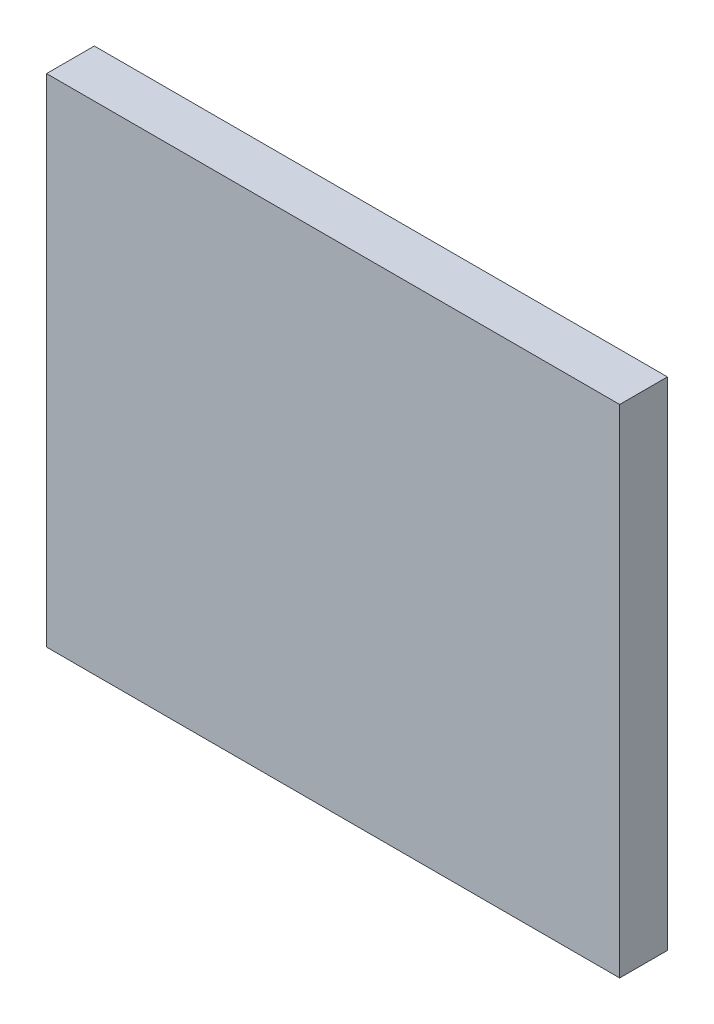
ISO-10303-21;
HEADER;
FILE_DESCRIPTION(('STEP AP214'),'2;1');
FILE_NAME('part.step','',(''),(''),'','','');
FILE_SCHEMA(('AUTOMOTIVE_DESIGN { 1 0 10303 214 1 1 1 1 }'));
ENDSEC;
DATA;
#1=APPLICATION_CONTEXT('core data for automotive mechanical design processes');
#2=APPLICATION_PROTOCOL_DEFINITION('international standard','automotive_design',2000,#1);
#3=PRODUCT_CONTEXT('',#1,'mechanical');
#4=PRODUCT('Part','Part','',(#3));
#5=PRODUCT_RELATED_PRODUCT_CATEGORY('part','',(#4));
#6=PRODUCT_DEFINITION_FORMATION('','',#4);
#7=PRODUCT_DEFINITION_CONTEXT('part definition',#1,'design');
#8=PRODUCT_DEFINITION('design','',#6,#7);
#9=PRODUCT_DEFINITION_SHAPE('','',#8);
#10=(LENGTH_UNIT() NAMED_UNIT(*) SI_UNIT(.MILLI.,.METRE.));
#11=(NAMED_UNIT(*) PLANE_ANGLE_UNIT() SI_UNIT($,.RADIAN.));
#12=(NAMED_UNIT(*) SI_UNIT($,.STERADIAN.) SOLID_ANGLE_UNIT());
#13=UNCERTAINTY_MEASURE_WITH_UNIT(LENGTH_MEASURE(1.E-05),#10,'distance_accuracy_value','');
#14=(GEOMETRIC_REPRESENTATION_CONTEXT(3) GLOBAL_UNCERTAINTY_ASSIGNED_CONTEXT((#13)) GLOBAL_UNIT_ASSIGNED_CONTEXT((#10,
#11,#12)) REPRESENTATION_CONTEXT('',''));
#15=CARTESIAN_POINT('',(0.,0.,0.));
#16=DIRECTION('',(0.,0.,1.));
#17=DIRECTION('',(1.,0.,0.));
#18=AXIS2_PLACEMENT_3D('',#15,#16,#17);
#19=CARTESIAN_POINT('',(30.,26.,5.));
#20=DIRECTION('',(-1.,0.,0.));
#21=DIRECTION('',(0.,-1.,0.));
#22=AXIS2_PLACEMENT_3D('',#19,#20,#21);
#23=PLANE('',#22);
#24=DIRECTION('',(0.,1.,0.));
#25=VECTOR('',#24,1.);
#26=CARTESIAN_POINT('',(30.,26.,0.));
#27=LINE('',#26,#25);
#28=CARTESIAN_POINT('',(30.,-26.,0.));
#29=VERTEX_POINT('',#28);
#30=CARTESIAN_POINT('',(30.,26.,0.));
#31=VERTEX_POINT('',#30);
#32=EDGE_CURVE('E107',#29,#31,#27,.T.);
#33=ORIENTED_EDGE('',*,*,#32,.T.);
#34=DIRECTION('',(0.,0.,-1.));
#35=VECTOR('',#34,1.);
#36=CARTESIAN_POINT('',(30.,26.,5.));
#37=LINE('',#36,#35);
#38=CARTESIAN_POINT('',(30.,26.,5.));
#39=VERTEX_POINT('',#38);
#40=EDGE_CURVE('E11',#39,#31,#37,.T.);
#41=ORIENTED_EDGE('',*,*,#40,.F.);
#42=DIRECTION('',(0.,1.,0.));
#43=VECTOR('',#42,1.);
#44=CARTESIAN_POINT('',(30.,26.,5.));
#45=LINE('',#44,#43);
#46=CARTESIAN_POINT('',(30.,-26.,5.));
#47=VERTEX_POINT('',#46);
#48=EDGE_CURVE('E91',#47,#39,#45,.T.);
#49=ORIENTED_EDGE('',*,*,#48,.F.);
#50=DIRECTION('',(0.,0.,-1.));
#51=VECTOR('',#50,1.);
#52=CARTESIAN_POINT('',(30.,-26.,5.));
#53=LINE('',#52,#51);
#54=EDGE_CURVE('E103',#47,#29,#53,.T.);
#55=ORIENTED_EDGE('',*,*,#54,.T.);
#56=EDGE_LOOP('',(#33,#41,#49,#55));
#57=FACE_BOUND('',#56,.T.);
#58=ADVANCED_FACE('F39',(#57),#23,.F.);
#59=CARTESIAN_POINT('',(-30.,26.,5.));
#60=DIRECTION('',(0.,-1.,0.));
#61=DIRECTION('',(0.,0.,-1.));
#62=AXIS2_PLACEMENT_3D('',#59,#60,#61);
#63=PLANE('',#62);
#64=DIRECTION('',(-1.,0.,0.));
#65=VECTOR('',#64,1.);
#66=CARTESIAN_POINT('',(-30.,26.,0.));
#67=LINE('',#66,#65);
#68=CARTESIAN_POINT('',(-30.,26.,0.));
#69=VERTEX_POINT('',#68);
#70=EDGE_CURVE('E96',#31,#69,#67,.T.);
#71=ORIENTED_EDGE('',*,*,#70,.T.);
#72=DIRECTION('',(0.,0.,-1.));
#73=VECTOR('',#72,1.);
#74=CARTESIAN_POINT('',(-30.,26.,5.));
#75=LINE('',#74,#73);
#76=CARTESIAN_POINT('',(-30.,26.,5.));
#77=VERTEX_POINT('',#76);
#78=EDGE_CURVE('E48',#77,#69,#75,.T.);
#79=ORIENTED_EDGE('',*,*,#78,.F.);
#80=DIRECTION('',(-1.,0.,0.));
#81=VECTOR('',#80,1.);
#82=CARTESIAN_POINT('',(-30.,26.,5.));
#83=LINE('',#82,#81);
#84=EDGE_CURVE('E86',#39,#77,#83,.T.);
#85=ORIENTED_EDGE('',*,*,#84,.F.);
#86=ORIENTED_EDGE('',*,*,#40,.T.);
#87=EDGE_LOOP('',(#71,#79,#85,#86));
#88=FACE_BOUND('',#87,.T.);
#89=ADVANCED_FACE('F95',(#88),#63,.F.);
#90=CARTESIAN_POINT('',(-30.,26.,5.));
#91=DIRECTION('',(1.,0.,0.));
#92=DIRECTION('',(0.,1.,0.));
#93=AXIS2_PLACEMENT_3D('',#90,#91,#92);
#94=PLANE('',#93);
#95=DIRECTION('',(0.,-1.,0.));
#96=VECTOR('',#95,1.);
#97=CARTESIAN_POINT('',(-30.,26.,0.));
#98=LINE('',#97,#96);
#99=CARTESIAN_POINT('',(-30.,-26.,0.));
#100=VERTEX_POINT('',#99);
#101=EDGE_CURVE('E73',#69,#100,#98,.T.);
#102=ORIENTED_EDGE('',*,*,#101,.T.);
#103=DIRECTION('',(0.,0.,-1.));
#104=VECTOR('',#103,1.);
#105=CARTESIAN_POINT('',(-30.,-26.,5.));
#106=LINE('',#105,#104);
#107=CARTESIAN_POINT('',(-30.,-26.,5.));
#108=VERTEX_POINT('',#107);
#109=EDGE_CURVE('E98',#108,#100,#106,.T.);
#110=ORIENTED_EDGE('',*,*,#109,.F.);
#111=DIRECTION('',(0.,-1.,0.));
#112=VECTOR('',#111,1.);
#113=CARTESIAN_POINT('',(-30.,26.,5.));
#114=LINE('',#113,#112);
#115=EDGE_CURVE('E89',#77,#108,#114,.T.);
#116=ORIENTED_EDGE('',*,*,#115,.F.);
#117=ORIENTED_EDGE('',*,*,#78,.T.);
#118=EDGE_LOOP('',(#102,#110,#116,#117));
#119=FACE_BOUND('',#118,.T.);
#120=ADVANCED_FACE('F99',(#119),#94,.F.);
#121=CARTESIAN_POINT('',(-30.,-26.,5.));
#122=DIRECTION('',(0.,1.,0.));
#123=DIRECTION('',(0.,0.,1.));
#124=AXIS2_PLACEMENT_3D('',#121,#122,#123);
#125=PLANE('',#124);
#126=DIRECTION('',(1.,0.,0.));
#127=VECTOR('',#126,1.);
#128=CARTESIAN_POINT('',(-30.,-26.,0.));
#129=LINE('',#128,#127);
#130=EDGE_CURVE('E79',#100,#29,#129,.T.);
#131=ORIENTED_EDGE('',*,*,#130,.T.);
#132=ORIENTED_EDGE('',*,*,#54,.F.);
#133=DIRECTION('',(1.,0.,0.));
#134=VECTOR('',#133,1.);
#135=CARTESIAN_POINT('',(-30.,-26.,5.));
#136=LINE('',#135,#134);
#137=EDGE_CURVE('E56',#108,#47,#136,.T.);
#138=ORIENTED_EDGE('',*,*,#137,.F.);
#139=ORIENTED_EDGE('',*,*,#109,.T.);
#140=EDGE_LOOP('',(#131,#132,#138,#139));
#141=FACE_BOUND('',#140,.T.);
#142=ADVANCED_FACE('F120',(#141),#125,.F.);
#143=CARTESIAN_POINT('',(0.,0.,5.));
#144=DIRECTION('',(0.,0.,1.));
#145=DIRECTION('',(1.,0.,0.));
#146=AXIS2_PLACEMENT_3D('',#143,#144,#145);
#147=PLANE('',#146);
#148=ORIENTED_EDGE('',*,*,#48,.T.);
#149=ORIENTED_EDGE('',*,*,#84,.T.);
#150=ORIENTED_EDGE('',*,*,#115,.T.);
#151=ORIENTED_EDGE('',*,*,#137,.T.);
#152=EDGE_LOOP('',(#148,#149,#150,#151));
#153=FACE_BOUND('',#152,.T.);
#154=ADVANCED_FACE('F87',(#153),#147,.T.);
#155=CARTESIAN_POINT('',(0.,0.,0.));
#156=DIRECTION('',(0.,0.,1.));
#157=DIRECTION('',(1.,0.,0.));
#158=AXIS2_PLACEMENT_3D('',#155,#156,#157);
#159=PLANE('',#158);
#160=ORIENTED_EDGE('',*,*,#32,.F.);
#161=ORIENTED_EDGE('',*,*,#130,.F.);
#162=ORIENTED_EDGE('',*,*,#101,.F.);
#163=ORIENTED_EDGE('',*,*,#70,.F.);
#164=EDGE_LOOP('',(#160,#161,#162,#163));
#165=FACE_BOUND('',#164,.T.);
#166=ADVANCED_FACE('F123',(#165),#159,.F.);
#167=CLOSED_SHELL('',(#58,#89,#120,#142,#154,#166));
#168=MANIFOLD_SOLID_BREP('B2',#167);
#169=ADVANCED_BREP_SHAPE_REPRESENTATION('',(#18,#168),#14);
#170=SHAPE_DEFINITION_REPRESENTATION(#9,#169);
ENDSEC;
END-ISO-10303-21;
